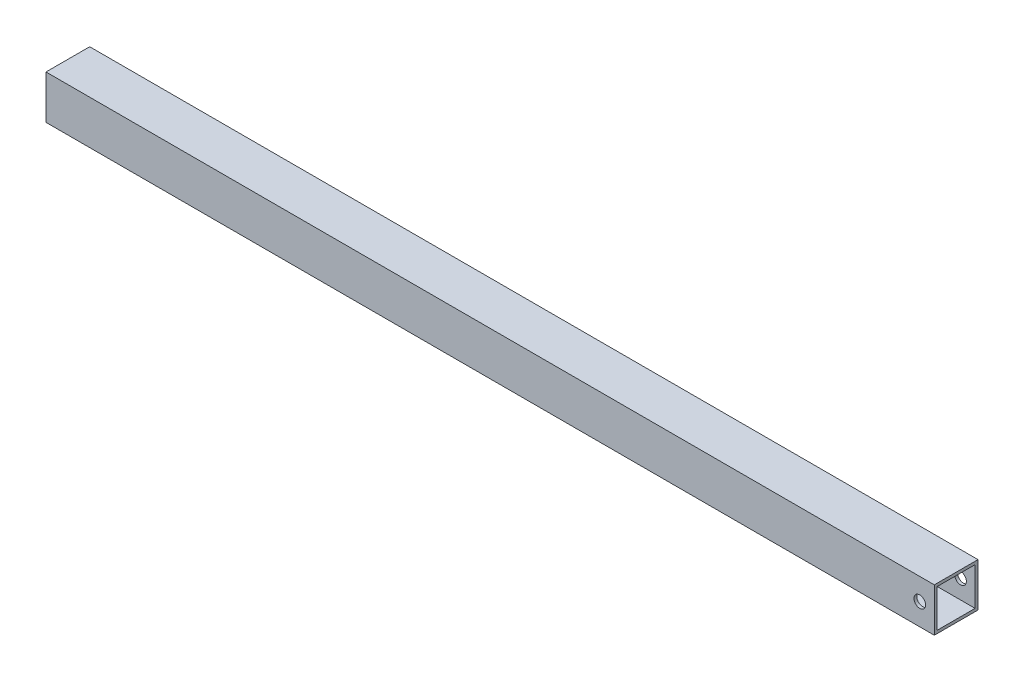
ISO-10303-21;
HEADER;
FILE_DESCRIPTION(('STEP AP214'),'2;1');
FILE_NAME('part.step','',(''),(''),'','','');
FILE_SCHEMA(('AUTOMOTIVE_DESIGN { 1 0 10303 214 1 1 1 1 }'));
ENDSEC;
DATA;
#1=APPLICATION_CONTEXT('core data for automotive mechanical design processes');
#2=APPLICATION_PROTOCOL_DEFINITION('international standard','automotive_design',2000,#1);
#3=PRODUCT_CONTEXT('',#1,'mechanical');
#4=PRODUCT('Part','Part','',(#3));
#5=PRODUCT_RELATED_PRODUCT_CATEGORY('part','',(#4));
#6=PRODUCT_DEFINITION_FORMATION('','',#4);
#7=PRODUCT_DEFINITION_CONTEXT('part definition',#1,'design');
#8=PRODUCT_DEFINITION('design','',#6,#7);
#9=PRODUCT_DEFINITION_SHAPE('','',#8);
#10=(LENGTH_UNIT() NAMED_UNIT(*) SI_UNIT(.MILLI.,.METRE.));
#11=(NAMED_UNIT(*) PLANE_ANGLE_UNIT() SI_UNIT($,.RADIAN.));
#12=(NAMED_UNIT(*) SI_UNIT($,.STERADIAN.) SOLID_ANGLE_UNIT());
#13=UNCERTAINTY_MEASURE_WITH_UNIT(LENGTH_MEASURE(1.E-05),#10,'distance_accuracy_value','');
#14=(GEOMETRIC_REPRESENTATION_CONTEXT(3) GLOBAL_UNCERTAINTY_ASSIGNED_CONTEXT((#13)) GLOBAL_UNIT_ASSIGNED_CONTEXT((#10,
#11,#12)) REPRESENTATION_CONTEXT('',''));
#15=CARTESIAN_POINT('',(0.,0.,0.));
#16=DIRECTION('',(0.,0.,1.));
#17=DIRECTION('',(1.,0.,0.));
#18=AXIS2_PLACEMENT_3D('',#15,#16,#17);
#19=CARTESIAN_POINT('',(610.,0.,0.));
#20=DIRECTION('',(-1.,0.,0.));
#21=DIRECTION('',(0.,0.,1.));
#22=AXIS2_PLACEMENT_3D('',#19,#20,#21);
#23=PLANE('',#22);
#24=DIRECTION('',(0.,-1.,0.));
#25=VECTOR('',#24,1.);
#26=CARTESIAN_POINT('',(610.,0.,0.));
#27=LINE('',#26,#25);
#28=CARTESIAN_POINT('',(610.,30.,0.));
#29=VERTEX_POINT('',#28);
#30=CARTESIAN_POINT('',(610.,0.,0.));
#31=VERTEX_POINT('',#30);
#32=EDGE_CURVE('E137',#29,#31,#27,.T.);
#33=ORIENTED_EDGE('',*,*,#32,.T.);
#34=DIRECTION('',(0.,0.,-1.));
#35=VECTOR('',#34,1.);
#36=CARTESIAN_POINT('',(610.,0.,0.));
#37=LINE('',#36,#35);
#38=CARTESIAN_POINT('',(610.,0.,-30.));
#39=VERTEX_POINT('',#38);
#40=EDGE_CURVE('E140',#31,#39,#37,.T.);
#41=ORIENTED_EDGE('',*,*,#40,.T.);
#42=DIRECTION('',(0.,1.,0.));
#43=VECTOR('',#42,1.);
#44=CARTESIAN_POINT('',(610.,0.,-30.));
#45=LINE('',#44,#43);
#46=CARTESIAN_POINT('',(610.,30.,-30.));
#47=VERTEX_POINT('',#46);
#48=EDGE_CURVE('E143',#39,#47,#45,.T.);
#49=ORIENTED_EDGE('',*,*,#48,.T.);
#50=DIRECTION('',(0.,0.,1.));
#51=VECTOR('',#50,1.);
#52=CARTESIAN_POINT('',(610.,30.,0.));
#53=LINE('',#52,#51);
#54=EDGE_CURVE('E145',#47,#29,#53,.T.);
#55=ORIENTED_EDGE('',*,*,#54,.T.);
#56=EDGE_LOOP('',(#33,#41,#49,#55));
#57=FACE_BOUND('',#56,.T.);
#58=DIRECTION('',(0.,-1.,0.));
#59=VECTOR('',#58,1.);
#60=CARTESIAN_POINT('',(610.,2.,-2.));
#61=LINE('',#60,#59);
#62=CARTESIAN_POINT('',(610.,28.,-2.));
#63=VERTEX_POINT('',#62);
#64=CARTESIAN_POINT('',(610.,2.,-2.));
#65=VERTEX_POINT('',#64);
#66=EDGE_CURVE('E99',#63,#65,#61,.T.);
#67=ORIENTED_EDGE('',*,*,#66,.F.);
#68=DIRECTION('',(0.,0.,1.));
#69=VECTOR('',#68,1.);
#70=CARTESIAN_POINT('',(610.,28.,-2.));
#71=LINE('',#70,#69);
#72=CARTESIAN_POINT('',(610.,28.,-28.));
#73=VERTEX_POINT('',#72);
#74=EDGE_CURVE('E121',#73,#63,#71,.T.);
#75=ORIENTED_EDGE('',*,*,#74,.F.);
#76=DIRECTION('',(0.,1.,0.));
#77=VECTOR('',#76,1.);
#78=CARTESIAN_POINT('',(610.,2.,-28.));
#79=LINE('',#78,#77);
#80=CARTESIAN_POINT('',(610.,2.,-28.));
#81=VERTEX_POINT('',#80);
#82=EDGE_CURVE('E119',#81,#73,#79,.T.);
#83=ORIENTED_EDGE('',*,*,#82,.F.);
#84=DIRECTION('',(0.,0.,-1.));
#85=VECTOR('',#84,1.);
#86=CARTESIAN_POINT('',(610.,2.,-2.));
#87=LINE('',#86,#85);
#88=EDGE_CURVE('E107',#65,#81,#87,.T.);
#89=ORIENTED_EDGE('',*,*,#88,.F.);
#90=EDGE_LOOP('',(#67,#75,#83,#89));
#91=FACE_BOUND('',#90,.T.);
#92=ADVANCED_FACE('F33',(#57,#91),#23,.F.);
#93=CARTESIAN_POINT('',(0.,0.,0.));
#94=DIRECTION('',(-1.,0.,0.));
#95=DIRECTION('',(0.,0.,1.));
#96=AXIS2_PLACEMENT_3D('',#93,#94,#95);
#97=PLANE('',#96);
#98=DIRECTION('',(0.,-1.,0.));
#99=VECTOR('',#98,1.);
#100=CARTESIAN_POINT('',(0.,0.,0.));
#101=LINE('',#100,#99);
#102=CARTESIAN_POINT('',(0.,30.,0.));
#103=VERTEX_POINT('',#102);
#104=CARTESIAN_POINT('',(0.,0.,0.));
#105=VERTEX_POINT('',#104);
#106=EDGE_CURVE('E115',#103,#105,#101,.T.);
#107=ORIENTED_EDGE('',*,*,#106,.F.);
#108=DIRECTION('',(0.,0.,1.));
#109=VECTOR('',#108,1.);
#110=CARTESIAN_POINT('',(0.,30.,0.));
#111=LINE('',#110,#109);
#112=CARTESIAN_POINT('',(0.,30.,-30.));
#113=VERTEX_POINT('',#112);
#114=EDGE_CURVE('E141',#113,#103,#111,.T.);
#115=ORIENTED_EDGE('',*,*,#114,.F.);
#116=DIRECTION('',(0.,1.,0.));
#117=VECTOR('',#116,1.);
#118=CARTESIAN_POINT('',(0.,0.,-30.));
#119=LINE('',#118,#117);
#120=CARTESIAN_POINT('',(0.,0.,-30.));
#121=VERTEX_POINT('',#120);
#122=EDGE_CURVE('E152',#121,#113,#119,.T.);
#123=ORIENTED_EDGE('',*,*,#122,.F.);
#124=DIRECTION('',(0.,0.,-1.));
#125=VECTOR('',#124,1.);
#126=CARTESIAN_POINT('',(0.,0.,0.));
#127=LINE('',#126,#125);
#128=EDGE_CURVE('E150',#105,#121,#127,.T.);
#129=ORIENTED_EDGE('',*,*,#128,.F.);
#130=EDGE_LOOP('',(#107,#115,#123,#129));
#131=FACE_BOUND('',#130,.T.);
#132=DIRECTION('',(0.,0.,1.));
#133=VECTOR('',#132,1.);
#134=CARTESIAN_POINT('',(0.,28.,-2.));
#135=LINE('',#134,#133);
#136=CARTESIAN_POINT('',(0.,28.,-28.));
#137=VERTEX_POINT('',#136);
#138=CARTESIAN_POINT('',(0.,28.,-2.));
#139=VERTEX_POINT('',#138);
#140=EDGE_CURVE('E108',#137,#139,#135,.T.);
#141=ORIENTED_EDGE('',*,*,#140,.T.);
#142=DIRECTION('',(0.,-1.,0.));
#143=VECTOR('',#142,1.);
#144=CARTESIAN_POINT('',(0.,2.,-2.));
#145=LINE('',#144,#143);
#146=CARTESIAN_POINT('',(0.,2.,-2.));
#147=VERTEX_POINT('',#146);
#148=EDGE_CURVE('E57',#139,#147,#145,.T.);
#149=ORIENTED_EDGE('',*,*,#148,.T.);
#150=DIRECTION('',(0.,0.,-1.));
#151=VECTOR('',#150,1.);
#152=CARTESIAN_POINT('',(0.,2.,-2.));
#153=LINE('',#152,#151);
#154=CARTESIAN_POINT('',(0.,2.,-28.));
#155=VERTEX_POINT('',#154);
#156=EDGE_CURVE('E114',#147,#155,#153,.T.);
#157=ORIENTED_EDGE('',*,*,#156,.T.);
#158=DIRECTION('',(0.,1.,0.));
#159=VECTOR('',#158,1.);
#160=CARTESIAN_POINT('',(0.,2.,-28.));
#161=LINE('',#160,#159);
#162=EDGE_CURVE('E129',#155,#137,#161,.T.);
#163=ORIENTED_EDGE('',*,*,#162,.T.);
#164=EDGE_LOOP('',(#141,#149,#157,#163));
#165=FACE_BOUND('',#164,.T.);
#166=ADVANCED_FACE('F171',(#131,#165),#97,.T.);
#167=CARTESIAN_POINT('',(610.,0.,0.));
#168=DIRECTION('',(0.,0.,-1.));
#169=DIRECTION('',(-1.,0.,0.));
#170=AXIS2_PLACEMENT_3D('',#167,#168,#169);
#171=PLANE('',#170);
#172=CARTESIAN_POINT('',(600.,15.,0.));
#173=DIRECTION('',(0.,0.,1.));
#174=DIRECTION('',(1.,0.,0.));
#175=AXIS2_PLACEMENT_3D('',#172,#173,#174);
#176=CIRCLE('',#175,3.99999999999999);
#177=CARTESIAN_POINT('',(604.,15.,0.));
#178=VERTEX_POINT('',#177);
#179=EDGE_CURVE('E214',#178,#178,#176,.T.);
#180=ORIENTED_EDGE('',*,*,#179,.F.);
#181=EDGE_LOOP('',(#180));
#182=FACE_BOUND('',#181,.T.);
#183=ORIENTED_EDGE('',*,*,#106,.T.);
#184=DIRECTION('',(-1.,0.,0.));
#185=VECTOR('',#184,1.);
#186=CARTESIAN_POINT('',(610.,0.,0.));
#187=LINE('',#186,#185);
#188=EDGE_CURVE('E11',#31,#105,#187,.T.);
#189=ORIENTED_EDGE('',*,*,#188,.F.);
#190=ORIENTED_EDGE('',*,*,#32,.F.);
#191=DIRECTION('',(-1.,0.,0.));
#192=VECTOR('',#191,1.);
#193=CARTESIAN_POINT('',(610.,30.,0.));
#194=LINE('',#193,#192);
#195=EDGE_CURVE('E147',#29,#103,#194,.T.);
#196=ORIENTED_EDGE('',*,*,#195,.T.);
#197=EDGE_LOOP('',(#183,#189,#190,#196));
#198=FACE_BOUND('',#197,.T.);
#199=ADVANCED_FACE('F35',(#182,#198),#171,.F.);
#200=CARTESIAN_POINT('',(610.,0.,0.));
#201=DIRECTION('',(0.,1.,0.));
#202=DIRECTION('',(0.,0.,1.));
#203=AXIS2_PLACEMENT_3D('',#200,#201,#202);
#204=PLANE('',#203);
#205=ORIENTED_EDGE('',*,*,#128,.T.);
#206=DIRECTION('',(-1.,0.,0.));
#207=VECTOR('',#206,1.);
#208=CARTESIAN_POINT('',(610.,0.,-30.));
#209=LINE('',#208,#207);
#210=EDGE_CURVE('E42',#39,#121,#209,.T.);
#211=ORIENTED_EDGE('',*,*,#210,.F.);
#212=ORIENTED_EDGE('',*,*,#40,.F.);
#213=ORIENTED_EDGE('',*,*,#188,.T.);
#214=EDGE_LOOP('',(#205,#211,#212,#213));
#215=FACE_BOUND('',#214,.T.);
#216=ADVANCED_FACE('F181',(#215),#204,.F.);
#217=CARTESIAN_POINT('',(610.,0.,-30.));
#218=DIRECTION('',(0.,0.,1.));
#219=DIRECTION('',(1.,0.,0.));
#220=AXIS2_PLACEMENT_3D('',#217,#218,#219);
#221=PLANE('',#220);
#222=CARTESIAN_POINT('',(600.,15.,-30.));
#223=DIRECTION('',(0.,0.,1.));
#224=DIRECTION('',(1.,0.,0.));
#225=AXIS2_PLACEMENT_3D('',#222,#223,#224);
#226=CIRCLE('',#225,3.99999999999999);
#227=CARTESIAN_POINT('',(604.,15.,-30.));
#228=VERTEX_POINT('',#227);
#229=EDGE_CURVE('E212',#228,#228,#226,.T.);
#230=ORIENTED_EDGE('',*,*,#229,.T.);
#231=EDGE_LOOP('',(#230));
#232=FACE_BOUND('',#231,.T.);
#233=ORIENTED_EDGE('',*,*,#122,.T.);
#234=DIRECTION('',(-1.,0.,0.));
#235=VECTOR('',#234,1.);
#236=CARTESIAN_POINT('',(610.,30.,-30.));
#237=LINE('',#236,#235);
#238=EDGE_CURVE('E157',#47,#113,#237,.T.);
#239=ORIENTED_EDGE('',*,*,#238,.F.);
#240=ORIENTED_EDGE('',*,*,#48,.F.);
#241=ORIENTED_EDGE('',*,*,#210,.T.);
#242=EDGE_LOOP('',(#233,#239,#240,#241));
#243=FACE_BOUND('',#242,.T.);
#244=ADVANCED_FACE('F165',(#232,#243),#221,.F.);
#245=CARTESIAN_POINT('',(610.,30.,0.));
#246=DIRECTION('',(0.,-1.,0.));
#247=DIRECTION('',(0.,0.,-1.));
#248=AXIS2_PLACEMENT_3D('',#245,#246,#247);
#249=PLANE('',#248);
#250=ORIENTED_EDGE('',*,*,#114,.T.);
#251=ORIENTED_EDGE('',*,*,#195,.F.);
#252=ORIENTED_EDGE('',*,*,#54,.F.);
#253=ORIENTED_EDGE('',*,*,#238,.T.);
#254=EDGE_LOOP('',(#250,#251,#252,#253));
#255=FACE_BOUND('',#254,.T.);
#256=ADVANCED_FACE('F175',(#255),#249,.F.);
#257=CARTESIAN_POINT('',(610.,2.,-2.));
#258=DIRECTION('',(0.,0.,-1.));
#259=DIRECTION('',(-1.,0.,0.));
#260=AXIS2_PLACEMENT_3D('',#257,#258,#259);
#261=PLANE('',#260);
#262=CARTESIAN_POINT('',(600.,15.,-2.));
#263=DIRECTION('',(0.,0.,-1.));
#264=DIRECTION('',(-1.,0.,0.));
#265=AXIS2_PLACEMENT_3D('',#262,#263,#264);
#266=CIRCLE('',#265,3.99999999999999);
#267=CARTESIAN_POINT('',(604.,15.,-1.99999999999999));
#268=VERTEX_POINT('',#267);
#269=EDGE_CURVE('E127',#268,#268,#266,.T.);
#270=ORIENTED_EDGE('',*,*,#269,.F.);
#271=EDGE_LOOP('',(#270));
#272=FACE_BOUND('',#271,.T.);
#273=ORIENTED_EDGE('',*,*,#148,.F.);
#274=DIRECTION('',(-1.,0.,0.));
#275=VECTOR('',#274,1.);
#276=CARTESIAN_POINT('',(610.,28.,-2.));
#277=LINE('',#276,#275);
#278=EDGE_CURVE('E103',#63,#139,#277,.T.);
#279=ORIENTED_EDGE('',*,*,#278,.F.);
#280=ORIENTED_EDGE('',*,*,#66,.T.);
#281=DIRECTION('',(-1.,0.,0.));
#282=VECTOR('',#281,1.);
#283=CARTESIAN_POINT('',(610.,2.,-2.));
#284=LINE('',#283,#282);
#285=EDGE_CURVE('E102',#65,#147,#284,.T.);
#286=ORIENTED_EDGE('',*,*,#285,.T.);
#287=EDGE_LOOP('',(#273,#279,#280,#286));
#288=FACE_BOUND('',#287,.T.);
#289=ADVANCED_FACE('F101',(#272,#288),#261,.T.);
#290=CARTESIAN_POINT('',(610.,2.,-2.));
#291=DIRECTION('',(0.,1.,0.));
#292=DIRECTION('',(0.,0.,1.));
#293=AXIS2_PLACEMENT_3D('',#290,#291,#292);
#294=PLANE('',#293);
#295=ORIENTED_EDGE('',*,*,#156,.F.);
#296=ORIENTED_EDGE('',*,*,#285,.F.);
#297=ORIENTED_EDGE('',*,*,#88,.T.);
#298=DIRECTION('',(-1.,0.,0.));
#299=VECTOR('',#298,1.);
#300=CARTESIAN_POINT('',(610.,2.,-28.));
#301=LINE('',#300,#299);
#302=EDGE_CURVE('E116',#81,#155,#301,.T.);
#303=ORIENTED_EDGE('',*,*,#302,.T.);
#304=EDGE_LOOP('',(#295,#296,#297,#303));
#305=FACE_BOUND('',#304,.T.);
#306=ADVANCED_FACE('F111',(#305),#294,.T.);
#307=CARTESIAN_POINT('',(610.,2.,-28.));
#308=DIRECTION('',(0.,0.,1.));
#309=DIRECTION('',(1.,0.,0.));
#310=AXIS2_PLACEMENT_3D('',#307,#308,#309);
#311=PLANE('',#310);
#312=CARTESIAN_POINT('',(600.,15.,-28.));
#313=DIRECTION('',(0.,0.,1.));
#314=DIRECTION('',(1.,0.,0.));
#315=AXIS2_PLACEMENT_3D('',#312,#313,#314);
#316=CIRCLE('',#315,3.99999999999999);
#317=CARTESIAN_POINT('',(604.,15.,-28.));
#318=VERTEX_POINT('',#317);
#319=EDGE_CURVE('E37',#318,#318,#316,.T.);
#320=ORIENTED_EDGE('',*,*,#319,.F.);
#321=EDGE_LOOP('',(#320));
#322=FACE_BOUND('',#321,.T.);
#323=ORIENTED_EDGE('',*,*,#162,.F.);
#324=ORIENTED_EDGE('',*,*,#302,.F.);
#325=ORIENTED_EDGE('',*,*,#82,.T.);
#326=DIRECTION('',(-1.,0.,0.));
#327=VECTOR('',#326,1.);
#328=CARTESIAN_POINT('',(610.,28.,-28.));
#329=LINE('',#328,#327);
#330=EDGE_CURVE('E49',#73,#137,#329,.T.);
#331=ORIENTED_EDGE('',*,*,#330,.T.);
#332=EDGE_LOOP('',(#323,#324,#325,#331));
#333=FACE_BOUND('',#332,.T.);
#334=ADVANCED_FACE('F207',(#322,#333),#311,.T.);
#335=CARTESIAN_POINT('',(610.,28.,-2.));
#336=DIRECTION('',(0.,-1.,0.));
#337=DIRECTION('',(0.,0.,-1.));
#338=AXIS2_PLACEMENT_3D('',#335,#336,#337);
#339=PLANE('',#338);
#340=ORIENTED_EDGE('',*,*,#140,.F.);
#341=ORIENTED_EDGE('',*,*,#330,.F.);
#342=ORIENTED_EDGE('',*,*,#74,.T.);
#343=ORIENTED_EDGE('',*,*,#278,.T.);
#344=EDGE_LOOP('',(#340,#341,#342,#343));
#345=FACE_BOUND('',#344,.T.);
#346=ADVANCED_FACE('F223',(#345),#339,.T.);
#347=CARTESIAN_POINT('',(600.,15.,-30.));
#348=DIRECTION('',(0.,0.,1.));
#349=DIRECTION('',(1.,0.,0.));
#350=AXIS2_PLACEMENT_3D('',#347,#348,#349);
#351=CYLINDRICAL_SURFACE('',#350,3.99999999999999);
#352=CARTESIAN_POINT('',(604.,15.,-28.));
#353=CARTESIAN_POINT('',(604.,15.,-28.0208333333333));
#354=CARTESIAN_POINT('',(604.,15.,-28.0416666666667));
#355=CARTESIAN_POINT('',(604.,15.,-28.0833333333333));
#356=CARTESIAN_POINT('',(604.,15.,-28.1041666666667));
#357=CARTESIAN_POINT('',(604.,15.,-28.1458333333333));
#358=CARTESIAN_POINT('',(604.,15.,-28.1666666666667));
#359=CARTESIAN_POINT('',(604.,15.,-28.2083333333333));
#360=CARTESIAN_POINT('',(604.,15.,-28.2291666666667));
#361=CARTESIAN_POINT('',(604.,15.,-28.2708333333333));
#362=CARTESIAN_POINT('',(604.,15.,-28.2916666666667));
#363=CARTESIAN_POINT('',(604.,15.,-28.3333333333333));
#364=CARTESIAN_POINT('',(604.,15.,-28.3541666666667));
#365=CARTESIAN_POINT('',(604.,15.,-28.3958333333333));
#366=CARTESIAN_POINT('',(604.,15.,-28.4166666666667));
#367=CARTESIAN_POINT('',(604.,15.,-28.4583333333333));
#368=CARTESIAN_POINT('',(604.,15.,-28.4791666666667));
#369=CARTESIAN_POINT('',(604.,15.,-28.5208333333333));
#370=CARTESIAN_POINT('',(604.,15.,-28.5416666666667));
#371=CARTESIAN_POINT('',(604.,15.,-28.5833333333333));
#372=CARTESIAN_POINT('',(604.,15.,-28.6041666666667));
#373=CARTESIAN_POINT('',(604.,15.,-28.6458333333333));
#374=CARTESIAN_POINT('',(604.,15.,-28.6666666666667));
#375=CARTESIAN_POINT('',(604.,15.,-28.7083333333333));
#376=CARTESIAN_POINT('',(604.,15.,-28.7291666666667));
#377=CARTESIAN_POINT('',(604.,15.,-28.7708333333333));
#378=CARTESIAN_POINT('',(604.,15.,-28.7916666666667));
#379=CARTESIAN_POINT('',(604.,15.,-28.8333333333333));
#380=CARTESIAN_POINT('',(604.,15.,-28.8541666666667));
#381=CARTESIAN_POINT('',(604.,15.,-28.8958333333333));
#382=CARTESIAN_POINT('',(604.,15.,-28.9166666666667));
#383=CARTESIAN_POINT('',(604.,15.,-28.9583333333333));
#384=CARTESIAN_POINT('',(604.,15.,-28.9791666666667));
#385=CARTESIAN_POINT('',(604.,15.,-29.0208333333333));
#386=CARTESIAN_POINT('',(604.,15.,-29.0416666666667));
#387=CARTESIAN_POINT('',(604.,15.,-29.0833333333333));
#388=CARTESIAN_POINT('',(604.,15.,-29.1041666666667));
#389=CARTESIAN_POINT('',(604.,15.,-29.1458333333333));
#390=CARTESIAN_POINT('',(604.,15.,-29.1666666666667));
#391=CARTESIAN_POINT('',(604.,15.,-29.2083333333333));
#392=CARTESIAN_POINT('',(604.,15.,-29.2291666666667));
#393=CARTESIAN_POINT('',(604.,15.,-29.2708333333333));
#394=CARTESIAN_POINT('',(604.,15.,-29.2916666666667));
#395=CARTESIAN_POINT('',(604.,15.,-29.3333333333333));
#396=CARTESIAN_POINT('',(604.,15.,-29.3541666666667));
#397=CARTESIAN_POINT('',(604.,15.,-29.3958333333333));
#398=CARTESIAN_POINT('',(604.,15.,-29.4166666666667));
#399=CARTESIAN_POINT('',(604.,15.,-29.4583333333333));
#400=CARTESIAN_POINT('',(604.,15.,-29.4791666666667));
#401=CARTESIAN_POINT('',(604.,15.,-29.5208333333333));
#402=CARTESIAN_POINT('',(604.,15.,-29.5416666666667));
#403=CARTESIAN_POINT('',(604.,15.,-29.5833333333333));
#404=CARTESIAN_POINT('',(604.,15.,-29.6041666666667));
#405=CARTESIAN_POINT('',(604.,15.,-29.6458333333333));
#406=CARTESIAN_POINT('',(604.,15.,-29.6666666666667));
#407=CARTESIAN_POINT('',(604.,15.,-29.7083333333333));
#408=CARTESIAN_POINT('',(604.,15.,-29.7291666666667));
#409=CARTESIAN_POINT('',(604.,15.,-29.7708333333333));
#410=CARTESIAN_POINT('',(604.,15.,-29.7916666666667));
#411=CARTESIAN_POINT('',(604.,15.,-29.8333333333333));
#412=CARTESIAN_POINT('',(604.,15.,-29.8541666666667));
#413=CARTESIAN_POINT('',(604.,15.,-29.8958333333333));
#414=CARTESIAN_POINT('',(604.,15.,-29.9166666666667));
#415=CARTESIAN_POINT('',(604.,15.,-29.9583333333333));
#416=CARTESIAN_POINT('',(604.,15.,-29.9791666666667));
#417=CARTESIAN_POINT('',(604.,15.,-30.));
#418=B_SPLINE_CURVE_WITH_KNOTS('',3,(#352,#353,#354,#355,#356,#357,#358,#359,#360,#361,#362,
#363,#364,#365,#366,#367,#368,#369,#370,#371,#372,#373,#374,#375,#376,#377,#378,#379,#380,#381,
#382,#383,#384,#385,#386,#387,#388,#389,#390,#391,#392,#393,#394,#395,#396,#397,#398,#399,#400,
#401,#402,#403,#404,#405,#406,#407,#408,#409,#410,#411,#412,#413,#414,#415,#416,#417),
.UNSPECIFIED.,.F.,.F.,(4,2,2,2,2,2,2,2,2,2,2,2,2,2,2,2,2,2,2,2,2,2,2,2,2,2,2,2,2,2,2,2,4),(0.,
0.0625000000000001,0.124999999999997,0.187499999999997,0.249999999999997,0.312499999999997,
0.374999999999997,0.437499999999997,0.499999999999997,0.562499999999997,0.624999999999997,
0.687499999999997,0.749999999999997,0.812499999999997,0.874999999999997,0.937499999999997,
0.999999999999997,1.0625,1.125,1.1875,1.25,1.3125,1.375,1.4375,1.5,1.5625,1.625,1.6875,1.75,
1.8125,1.875,1.9375,1.99999999999999),.UNSPECIFIED.);
#419=EDGE_CURVE('BSEAM220',#318,#228,#418,.T.);
#420=ORIENTED_EDGE('',*,*,#319,.T.);
#421=ORIENTED_EDGE('',*,*,#229,.F.);
#422=ORIENTED_EDGE('',*,*,#419,.T.);
#423=ORIENTED_EDGE('',*,*,#419,.F.);
#424=EDGE_LOOP('',(#420,#422,#421,#423));
#425=FACE_BOUND('',#424,.T.);
#426=ADVANCED_FACE('F220',(#425),#351,.F.);
#427=CARTESIAN_POINT('',(604.,15.,-1.99999999999999));
#428=CARTESIAN_POINT('',(604.,15.,-1.97916666666666));
#429=CARTESIAN_POINT('',(604.,15.,-1.95833333333333));
#430=CARTESIAN_POINT('',(604.,15.,-1.91666666666666));
#431=CARTESIAN_POINT('',(604.,15.,-1.89583333333333));
#432=CARTESIAN_POINT('',(604.,15.,-1.85416666666666));
#433=CARTESIAN_POINT('',(604.,15.,-1.83333333333333));
#434=CARTESIAN_POINT('',(604.,15.,-1.79166666666666));
#435=CARTESIAN_POINT('',(604.,15.,-1.77083333333333));
#436=CARTESIAN_POINT('',(604.,15.,-1.72916666666666));
#437=CARTESIAN_POINT('',(604.,15.,-1.70833333333333));
#438=CARTESIAN_POINT('',(604.,15.,-1.66666666666666));
#439=CARTESIAN_POINT('',(604.,15.,-1.64583333333333));
#440=CARTESIAN_POINT('',(604.,15.,-1.60416666666666));
#441=CARTESIAN_POINT('',(604.,15.,-1.58333333333333));
#442=CARTESIAN_POINT('',(604.,15.,-1.54166666666666));
#443=CARTESIAN_POINT('',(604.,15.,-1.52083333333333));
#444=CARTESIAN_POINT('',(604.,15.,-1.47916666666666));
#445=CARTESIAN_POINT('',(604.,15.,-1.45833333333333));
#446=CARTESIAN_POINT('',(604.,15.,-1.41666666666666));
#447=CARTESIAN_POINT('',(604.,15.,-1.39583333333333));
#448=CARTESIAN_POINT('',(604.,15.,-1.35416666666666));
#449=CARTESIAN_POINT('',(604.,15.,-1.33333333333333));
#450=CARTESIAN_POINT('',(604.,15.,-1.29166666666666));
#451=CARTESIAN_POINT('',(604.,15.,-1.27083333333333));
#452=CARTESIAN_POINT('',(604.,15.,-1.22916666666666));
#453=CARTESIAN_POINT('',(604.,15.,-1.20833333333333));
#454=CARTESIAN_POINT('',(604.,15.,-1.16666666666666));
#455=CARTESIAN_POINT('',(604.,15.,-1.14583333333333));
#456=CARTESIAN_POINT('',(604.,15.,-1.10416666666666));
#457=CARTESIAN_POINT('',(604.,15.,-1.08333333333333));
#458=CARTESIAN_POINT('',(604.,15.,-1.04166666666666));
#459=CARTESIAN_POINT('',(604.,15.,-1.02083333333333));
#460=CARTESIAN_POINT('',(604.,15.,-0.979166666666664));
#461=CARTESIAN_POINT('',(604.,15.,-0.958333333333331));
#462=CARTESIAN_POINT('',(604.,15.,-0.916666666666664));
#463=CARTESIAN_POINT('',(604.,15.,-0.895833333333331));
#464=CARTESIAN_POINT('',(604.,15.,-0.854166666666664));
#465=CARTESIAN_POINT('',(604.,15.,-0.833333333333331));
#466=CARTESIAN_POINT('',(604.,15.,-0.791666666666664));
#467=CARTESIAN_POINT('',(604.,15.,-0.77083333333333));
#468=CARTESIAN_POINT('',(604.,15.,-0.729166666666664));
#469=CARTESIAN_POINT('',(604.,15.,-0.70833333333333));
#470=CARTESIAN_POINT('',(604.,15.,-0.666666666666664));
#471=CARTESIAN_POINT('',(604.,15.,-0.64583333333333));
#472=CARTESIAN_POINT('',(604.,15.,-0.604166666666664));
#473=CARTESIAN_POINT('',(604.,15.,-0.58333333333333));
#474=CARTESIAN_POINT('',(604.,15.,-0.541666666666665));
#475=CARTESIAN_POINT('',(604.,15.,-0.520833333333333));
#476=CARTESIAN_POINT('',(604.,15.,-0.479166666666667));
#477=CARTESIAN_POINT('',(604.,15.,-0.458333333333334));
#478=CARTESIAN_POINT('',(604.,15.,-0.416666666666667));
#479=CARTESIAN_POINT('',(604.,15.,-0.395833333333334));
#480=CARTESIAN_POINT('',(604.,15.,-0.354166666666667));
#481=CARTESIAN_POINT('',(604.,15.,-0.333333333333334));
#482=CARTESIAN_POINT('',(604.,15.,-0.291666666666667));
#483=CARTESIAN_POINT('',(604.,15.,-0.270833333333334));
#484=CARTESIAN_POINT('',(604.,15.,-0.229166666666667));
#485=CARTESIAN_POINT('',(604.,15.,-0.208333333333334));
#486=CARTESIAN_POINT('',(604.,15.,-0.166666666666667));
#487=CARTESIAN_POINT('',(604.,15.,-0.145833333333333));
#488=CARTESIAN_POINT('',(604.,15.,-0.104166666666667));
#489=CARTESIAN_POINT('',(604.,15.,-0.0833333333333334));
#490=CARTESIAN_POINT('',(604.,15.,-0.0416666666666667));
#491=CARTESIAN_POINT('',(604.,15.,-0.0208333333333333));
#492=CARTESIAN_POINT('',(604.,15.,0.));
#493=B_SPLINE_CURVE_WITH_KNOTS('',3,(#427,#428,#429,#430,#431,#432,#433,#434,#435,#436,#437,
#438,#439,#440,#441,#442,#443,#444,#445,#446,#447,#448,#449,#450,#451,#452,#453,#454,#455,#456,
#457,#458,#459,#460,#461,#462,#463,#464,#465,#466,#467,#468,#469,#470,#471,#472,#473,#474,#475,
#476,#477,#478,#479,#480,#481,#482,#483,#484,#485,#486,#487,#488,#489,#490,#491,#492),
.UNSPECIFIED.,.F.,.F.,(4,2,2,2,2,2,2,2,2,2,2,2,2,2,2,2,2,2,2,2,2,2,2,2,2,2,2,2,2,2,2,2,4),(0.,
0.0625000000000001,0.125,0.1875,0.25,0.3125,0.375,0.4375,0.5,0.562499999999997,
0.624999999999997,0.687499999999997,0.749999999999997,0.812499999999997,0.874999999999997,
0.937499999999997,0.999999999999997,1.0625,1.125,1.1875,1.25,1.3125,1.375,1.4375,
1.49999999999999,1.56249999999999,1.62499999999999,1.68749999999999,1.74999999999999,
1.81249999999999,1.87499999999999,1.93749999999999,1.99999999999999),.UNSPECIFIED.);
#494=EDGE_CURVE('BSEAM222',#268,#178,#493,.T.);
#495=ORIENTED_EDGE('',*,*,#269,.T.);
#496=ORIENTED_EDGE('',*,*,#179,.T.);
#497=ORIENTED_EDGE('',*,*,#494,.T.);
#498=ORIENTED_EDGE('',*,*,#494,.F.);
#499=EDGE_LOOP('',(#495,#497,#496,#498));
#500=FACE_BOUND('',#499,.T.);
#501=ADVANCED_FACE('F222',(#500),#351,.F.);
#502=CLOSED_SHELL('',(#92,#166,#199,#216,#244,#256,#289,#306,#334,#346,#426,#501));
#503=MANIFOLD_SOLID_BREP('B2',#502);
#504=ADVANCED_BREP_SHAPE_REPRESENTATION('',(#18,#503),#14);
#505=SHAPE_DEFINITION_REPRESENTATION(#9,#504);
ENDSEC;
END-ISO-10303-21;
